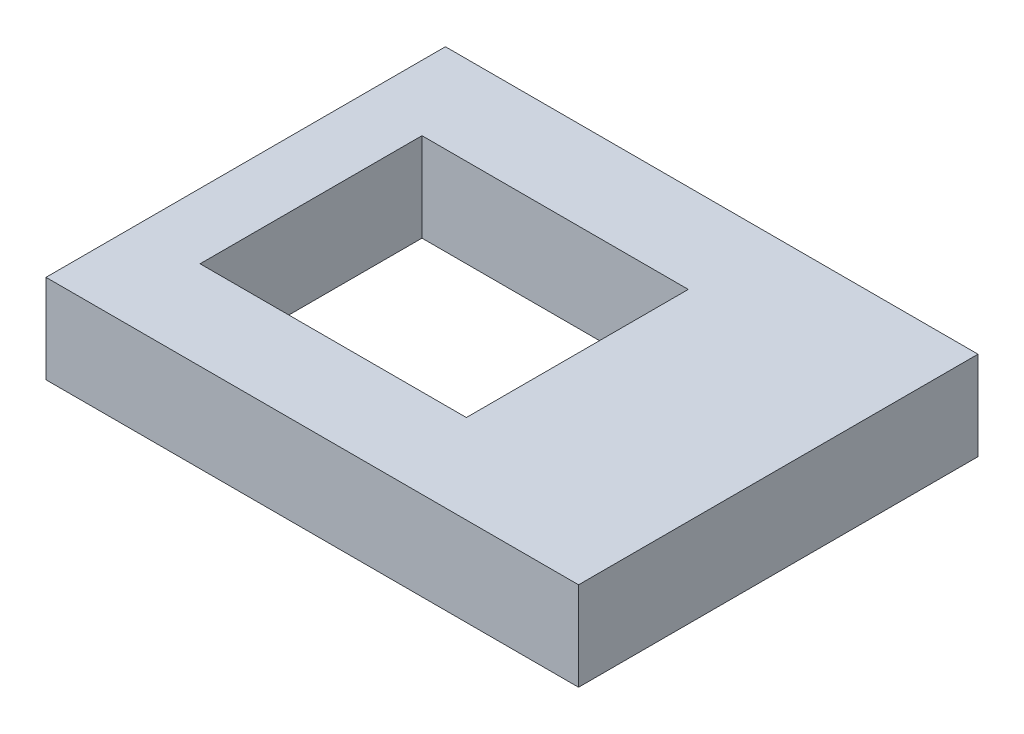
ISO-10303-21;
HEADER;
FILE_DESCRIPTION(('STEP AP214'),'2;1');
FILE_NAME('part.step','',(''),(''),'','','');
FILE_SCHEMA(('AUTOMOTIVE_DESIGN { 1 0 10303 214 1 1 1 1 }'));
ENDSEC;
DATA;
#1=APPLICATION_CONTEXT('core data for automotive mechanical design processes');
#2=APPLICATION_PROTOCOL_DEFINITION('international standard','automotive_design',2000,#1);
#3=PRODUCT_CONTEXT('',#1,'mechanical');
#4=PRODUCT('Part','Part','',(#3));
#5=PRODUCT_RELATED_PRODUCT_CATEGORY('part','',(#4));
#6=PRODUCT_DEFINITION_FORMATION('','',#4);
#7=PRODUCT_DEFINITION_CONTEXT('part definition',#1,'design');
#8=PRODUCT_DEFINITION('design','',#6,#7);
#9=PRODUCT_DEFINITION_SHAPE('','',#8);
#10=(LENGTH_UNIT() NAMED_UNIT(*) SI_UNIT(.MILLI.,.METRE.));
#11=(NAMED_UNIT(*) PLANE_ANGLE_UNIT() SI_UNIT($,.RADIAN.));
#12=(NAMED_UNIT(*) SI_UNIT($,.STERADIAN.) SOLID_ANGLE_UNIT());
#13=UNCERTAINTY_MEASURE_WITH_UNIT(LENGTH_MEASURE(1.E-05),#10,'distance_accuracy_value','');
#14=(GEOMETRIC_REPRESENTATION_CONTEXT(3) GLOBAL_UNCERTAINTY_ASSIGNED_CONTEXT((#13)) GLOBAL_UNIT_ASSIGNED_CONTEXT((#10,
#11,#12)) REPRESENTATION_CONTEXT('',''));
#15=CARTESIAN_POINT('',(0.,0.,0.));
#16=DIRECTION('',(0.,0.,1.));
#17=DIRECTION('',(1.,0.,0.));
#18=AXIS2_PLACEMENT_3D('',#15,#16,#17);
#19=CARTESIAN_POINT('',(76.2,25.4,57.15));
#20=DIRECTION('',(-1.,0.,0.));
#21=DIRECTION('',(0.,0.,1.));
#22=AXIS2_PLACEMENT_3D('',#19,#20,#21);
#23=PLANE('',#22);
#24=DIRECTION('',(0.,0.,-1.));
#25=VECTOR('',#24,1.);
#26=CARTESIAN_POINT('',(76.2,0.,57.15));
#27=LINE('',#26,#25);
#28=CARTESIAN_POINT('',(76.2,0.,57.15));
#29=VERTEX_POINT('',#28);
#30=CARTESIAN_POINT('',(76.2,0.,-57.15));
#31=VERTEX_POINT('',#30);
#32=EDGE_CURVE('E147',#29,#31,#27,.T.);
#33=ORIENTED_EDGE('',*,*,#32,.T.);
#34=DIRECTION('',(0.,-1.,0.));
#35=VECTOR('',#34,1.);
#36=CARTESIAN_POINT('',(76.2,25.4,-57.15));
#37=LINE('',#36,#35);
#38=CARTESIAN_POINT('',(76.2,25.4,-57.15));
#39=VERTEX_POINT('',#38);
#40=EDGE_CURVE('E11',#39,#31,#37,.T.);
#41=ORIENTED_EDGE('',*,*,#40,.F.);
#42=DIRECTION('',(0.,0.,-1.));
#43=VECTOR('',#42,1.);
#44=CARTESIAN_POINT('',(76.2,25.4,57.15));
#45=LINE('',#44,#43);
#46=CARTESIAN_POINT('',(76.2,25.4,57.15));
#47=VERTEX_POINT('',#46);
#48=EDGE_CURVE('E153',#47,#39,#45,.T.);
#49=ORIENTED_EDGE('',*,*,#48,.F.);
#50=DIRECTION('',(0.,-1.,0.));
#51=VECTOR('',#50,1.);
#52=CARTESIAN_POINT('',(76.2,25.4,57.15));
#53=LINE('',#52,#51);
#54=EDGE_CURVE('E167',#47,#29,#53,.T.);
#55=ORIENTED_EDGE('',*,*,#54,.T.);
#56=EDGE_LOOP('',(#33,#41,#49,#55));
#57=FACE_BOUND('',#56,.T.);
#58=ADVANCED_FACE('F39',(#57),#23,.F.);
#59=CARTESIAN_POINT('',(-76.2,25.4,-57.15));
#60=DIRECTION('',(0.,0.,1.));
#61=DIRECTION('',(1.,0.,0.));
#62=AXIS2_PLACEMENT_3D('',#59,#60,#61);
#63=PLANE('',#62);
#64=DIRECTION('',(-1.,0.,0.));
#65=VECTOR('',#64,1.);
#66=CARTESIAN_POINT('',(-76.2,0.,-57.15));
#67=LINE('',#66,#65);
#68=CARTESIAN_POINT('',(-76.2,0.,-57.15));
#69=VERTEX_POINT('',#68);
#70=EDGE_CURVE('E171',#31,#69,#67,.T.);
#71=ORIENTED_EDGE('',*,*,#70,.T.);
#72=DIRECTION('',(0.,-1.,0.));
#73=VECTOR('',#72,1.);
#74=CARTESIAN_POINT('',(-76.2,25.4,-57.15));
#75=LINE('',#74,#73);
#76=CARTESIAN_POINT('',(-76.2,25.4,-57.15));
#77=VERTEX_POINT('',#76);
#78=EDGE_CURVE('E47',#77,#69,#75,.T.);
#79=ORIENTED_EDGE('',*,*,#78,.F.);
#80=DIRECTION('',(-1.,0.,0.));
#81=VECTOR('',#80,1.);
#82=CARTESIAN_POINT('',(-76.2,25.4,-57.15));
#83=LINE('',#82,#81);
#84=EDGE_CURVE('E157',#39,#77,#83,.T.);
#85=ORIENTED_EDGE('',*,*,#84,.F.);
#86=ORIENTED_EDGE('',*,*,#40,.T.);
#87=EDGE_LOOP('',(#71,#79,#85,#86));
#88=FACE_BOUND('',#87,.T.);
#89=ADVANCED_FACE('F205',(#88),#63,.F.);
#90=CARTESIAN_POINT('',(-76.2,25.4,57.15));
#91=DIRECTION('',(1.,0.,0.));
#92=DIRECTION('',(0.,0.,-1.));
#93=AXIS2_PLACEMENT_3D('',#90,#91,#92);
#94=PLANE('',#93);
#95=DIRECTION('',(0.,0.,1.));
#96=VECTOR('',#95,1.);
#97=CARTESIAN_POINT('',(-76.2,0.,57.15));
#98=LINE('',#97,#96);
#99=CARTESIAN_POINT('',(-76.2,0.,57.15));
#100=VERTEX_POINT('',#99);
#101=EDGE_CURVE('E174',#69,#100,#98,.T.);
#102=ORIENTED_EDGE('',*,*,#101,.T.);
#103=DIRECTION('',(0.,-1.,0.));
#104=VECTOR('',#103,1.);
#105=CARTESIAN_POINT('',(-76.2,25.4,57.15));
#106=LINE('',#105,#104);
#107=CARTESIAN_POINT('',(-76.2,25.4,57.15));
#108=VERTEX_POINT('',#107);
#109=EDGE_CURVE('E182',#108,#100,#106,.T.);
#110=ORIENTED_EDGE('',*,*,#109,.F.);
#111=DIRECTION('',(0.,0.,1.));
#112=VECTOR('',#111,1.);
#113=CARTESIAN_POINT('',(-76.2,25.4,57.15));
#114=LINE('',#113,#112);
#115=EDGE_CURVE('E161',#77,#108,#114,.T.);
#116=ORIENTED_EDGE('',*,*,#115,.F.);
#117=ORIENTED_EDGE('',*,*,#78,.T.);
#118=EDGE_LOOP('',(#102,#110,#116,#117));
#119=FACE_BOUND('',#118,.T.);
#120=ADVANCED_FACE('F191',(#119),#94,.F.);
#121=CARTESIAN_POINT('',(-76.2,25.4,57.15));
#122=DIRECTION('',(0.,0.,-1.));
#123=DIRECTION('',(-1.,0.,0.));
#124=AXIS2_PLACEMENT_3D('',#121,#122,#123);
#125=PLANE('',#124);
#126=DIRECTION('',(1.,0.,0.));
#127=VECTOR('',#126,1.);
#128=CARTESIAN_POINT('',(-76.2,0.,57.15));
#129=LINE('',#128,#127);
#130=EDGE_CURVE('E158',#100,#29,#129,.T.);
#131=ORIENTED_EDGE('',*,*,#130,.T.);
#132=ORIENTED_EDGE('',*,*,#54,.F.);
#133=DIRECTION('',(1.,0.,0.));
#134=VECTOR('',#133,1.);
#135=CARTESIAN_POINT('',(-76.2,25.4,57.15));
#136=LINE('',#135,#134);
#137=EDGE_CURVE('E164',#108,#47,#136,.T.);
#138=ORIENTED_EDGE('',*,*,#137,.F.);
#139=ORIENTED_EDGE('',*,*,#109,.T.);
#140=EDGE_LOOP('',(#131,#132,#138,#139));
#141=FACE_BOUND('',#140,.T.);
#142=ADVANCED_FACE('F198',(#141),#125,.F.);
#143=CARTESIAN_POINT('',(0.,25.4,0.));
#144=DIRECTION('',(0.,-1.,0.));
#145=DIRECTION('',(0.,0.,-1.));
#146=AXIS2_PLACEMENT_3D('',#143,#144,#145);
#147=PLANE('',#146);
#148=DIRECTION('',(-1.,0.,0.));
#149=VECTOR('',#148,1.);
#150=CARTESIAN_POINT('',(-57.5070941527196,25.4,-31.75));
#151=LINE('',#150,#149);
#152=CARTESIAN_POINT('',(18.6929058472804,25.4,-31.75));
#153=VERTEX_POINT('',#152);
#154=CARTESIAN_POINT('',(-57.5070941527196,25.4,-31.75));
#155=VERTEX_POINT('',#154);
#156=EDGE_CURVE('E138',#153,#155,#151,.T.);
#157=ORIENTED_EDGE('',*,*,#156,.F.);
#158=DIRECTION('',(0.,0.,-1.));
#159=VECTOR('',#158,1.);
#160=CARTESIAN_POINT('',(18.6929058472804,25.4,31.75));
#161=LINE('',#160,#159);
#162=CARTESIAN_POINT('',(18.6929058472804,25.4,31.75));
#163=VERTEX_POINT('',#162);
#164=EDGE_CURVE('E54',#163,#153,#161,.T.);
#165=ORIENTED_EDGE('',*,*,#164,.F.);
#166=DIRECTION('',(1.,0.,0.));
#167=VECTOR('',#166,1.);
#168=CARTESIAN_POINT('',(-57.5070941527196,25.4,31.75));
#169=LINE('',#168,#167);
#170=CARTESIAN_POINT('',(-57.5070941527196,25.4,31.75));
#171=VERTEX_POINT('',#170);
#172=EDGE_CURVE('E125',#171,#163,#169,.T.);
#173=ORIENTED_EDGE('',*,*,#172,.F.);
#174=DIRECTION('',(0.,0.,1.));
#175=VECTOR('',#174,1.);
#176=CARTESIAN_POINT('',(-57.5070941527196,25.4,31.75));
#177=LINE('',#176,#175);
#178=EDGE_CURVE('E129',#155,#171,#177,.T.);
#179=ORIENTED_EDGE('',*,*,#178,.F.);
#180=EDGE_LOOP('',(#157,#165,#173,#179));
#181=FACE_BOUND('',#180,.T.);
#182=ORIENTED_EDGE('',*,*,#48,.T.);
#183=ORIENTED_EDGE('',*,*,#84,.T.);
#184=ORIENTED_EDGE('',*,*,#115,.T.);
#185=ORIENTED_EDGE('',*,*,#137,.T.);
#186=EDGE_LOOP('',(#182,#183,#184,#185));
#187=FACE_BOUND('',#186,.T.);
#188=ADVANCED_FACE('F204',(#181,#187),#147,.F.);
#189=CARTESIAN_POINT('',(0.,0.,0.));
#190=DIRECTION('',(0.,-1.,0.));
#191=DIRECTION('',(0.,0.,-1.));
#192=AXIS2_PLACEMENT_3D('',#189,#190,#191);
#193=PLANE('',#192);
#194=DIRECTION('',(0.,0.,-1.));
#195=VECTOR('',#194,1.);
#196=CARTESIAN_POINT('',(18.6929058472804,0.,31.75));
#197=LINE('',#196,#195);
#198=CARTESIAN_POINT('',(18.6929058472804,0.,31.75));
#199=VERTEX_POINT('',#198);
#200=CARTESIAN_POINT('',(18.6929058472804,0.,-31.75));
#201=VERTEX_POINT('',#200);
#202=EDGE_CURVE('E106',#199,#201,#197,.T.);
#203=ORIENTED_EDGE('',*,*,#202,.T.);
#204=DIRECTION('',(-1.,0.,0.));
#205=VECTOR('',#204,1.);
#206=CARTESIAN_POINT('',(-57.5070941527196,0.,-31.75));
#207=LINE('',#206,#205);
#208=CARTESIAN_POINT('',(-57.5070941527196,0.,-31.75));
#209=VERTEX_POINT('',#208);
#210=EDGE_CURVE('E116',#201,#209,#207,.T.);
#211=ORIENTED_EDGE('',*,*,#210,.T.);
#212=DIRECTION('',(0.,0.,1.));
#213=VECTOR('',#212,1.);
#214=CARTESIAN_POINT('',(-57.5070941527196,0.,31.75));
#215=LINE('',#214,#213);
#216=CARTESIAN_POINT('',(-57.5070941527196,0.,31.75));
#217=VERTEX_POINT('',#216);
#218=EDGE_CURVE('E62',#209,#217,#215,.T.);
#219=ORIENTED_EDGE('',*,*,#218,.T.);
#220=DIRECTION('',(1.,0.,0.));
#221=VECTOR('',#220,1.);
#222=CARTESIAN_POINT('',(-57.5070941527196,0.,31.75));
#223=LINE('',#222,#221);
#224=EDGE_CURVE('E113',#217,#199,#223,.T.);
#225=ORIENTED_EDGE('',*,*,#224,.T.);
#226=EDGE_LOOP('',(#203,#211,#219,#225));
#227=FACE_BOUND('',#226,.T.);
#228=ORIENTED_EDGE('',*,*,#32,.F.);
#229=ORIENTED_EDGE('',*,*,#130,.F.);
#230=ORIENTED_EDGE('',*,*,#101,.F.);
#231=ORIENTED_EDGE('',*,*,#70,.F.);
#232=EDGE_LOOP('',(#228,#229,#230,#231));
#233=FACE_BOUND('',#232,.T.);
#234=ADVANCED_FACE('F121',(#227,#233),#193,.T.);
#235=CARTESIAN_POINT('',(18.6929058472804,0.,31.75));
#236=DIRECTION('',(1.,0.,0.));
#237=DIRECTION('',(0.,0.,-1.));
#238=AXIS2_PLACEMENT_3D('',#235,#236,#237);
#239=PLANE('',#238);
#240=ORIENTED_EDGE('',*,*,#164,.T.);
#241=DIRECTION('',(0.,1.,0.));
#242=VECTOR('',#241,1.);
#243=CARTESIAN_POINT('',(18.6929058472804,0.,-31.75));
#244=LINE('',#243,#242);
#245=EDGE_CURVE('E102',#201,#153,#244,.T.);
#246=ORIENTED_EDGE('',*,*,#245,.F.);
#247=ORIENTED_EDGE('',*,*,#202,.F.);
#248=DIRECTION('',(0.,1.,0.));
#249=VECTOR('',#248,1.);
#250=CARTESIAN_POINT('',(18.6929058472804,0.,31.75));
#251=LINE('',#250,#249);
#252=EDGE_CURVE('E144',#199,#163,#251,.T.);
#253=ORIENTED_EDGE('',*,*,#252,.T.);
#254=EDGE_LOOP('',(#240,#246,#247,#253));
#255=FACE_BOUND('',#254,.T.);
#256=ADVANCED_FACE('F104',(#255),#239,.F.);
#257=CARTESIAN_POINT('',(-57.5070941527196,0.,31.75));
#258=DIRECTION('',(0.,0.,1.));
#259=DIRECTION('',(1.,0.,0.));
#260=AXIS2_PLACEMENT_3D('',#257,#258,#259);
#261=PLANE('',#260);
#262=ORIENTED_EDGE('',*,*,#172,.T.);
#263=ORIENTED_EDGE('',*,*,#252,.F.);
#264=ORIENTED_EDGE('',*,*,#224,.F.);
#265=DIRECTION('',(0.,1.,0.));
#266=VECTOR('',#265,1.);
#267=CARTESIAN_POINT('',(-57.5070941527196,0.,31.75));
#268=LINE('',#267,#266);
#269=EDGE_CURVE('E148',#217,#171,#268,.T.);
#270=ORIENTED_EDGE('',*,*,#269,.T.);
#271=EDGE_LOOP('',(#262,#263,#264,#270));
#272=FACE_BOUND('',#271,.T.);
#273=ADVANCED_FACE('F222',(#272),#261,.F.);
#274=CARTESIAN_POINT('',(-57.5070941527196,0.,31.75));
#275=DIRECTION('',(-1.,0.,0.));
#276=DIRECTION('',(0.,0.,1.));
#277=AXIS2_PLACEMENT_3D('',#274,#275,#276);
#278=PLANE('',#277);
#279=ORIENTED_EDGE('',*,*,#178,.T.);
#280=ORIENTED_EDGE('',*,*,#269,.F.);
#281=ORIENTED_EDGE('',*,*,#218,.F.);
#282=DIRECTION('',(0.,1.,0.));
#283=VECTOR('',#282,1.);
#284=CARTESIAN_POINT('',(-57.5070941527196,0.,-31.75));
#285=LINE('',#284,#283);
#286=EDGE_CURVE('E112',#209,#155,#285,.T.);
#287=ORIENTED_EDGE('',*,*,#286,.T.);
#288=EDGE_LOOP('',(#279,#280,#281,#287));
#289=FACE_BOUND('',#288,.T.);
#290=ADVANCED_FACE('F225',(#289),#278,.F.);
#291=CARTESIAN_POINT('',(-57.5070941527196,0.,-31.75));
#292=DIRECTION('',(0.,0.,-1.));
#293=DIRECTION('',(-1.,0.,0.));
#294=AXIS2_PLACEMENT_3D('',#291,#292,#293);
#295=PLANE('',#294);
#296=ORIENTED_EDGE('',*,*,#156,.T.);
#297=ORIENTED_EDGE('',*,*,#286,.F.);
#298=ORIENTED_EDGE('',*,*,#210,.F.);
#299=ORIENTED_EDGE('',*,*,#245,.T.);
#300=EDGE_LOOP('',(#296,#297,#298,#299));
#301=FACE_BOUND('',#300,.T.);
#302=ADVANCED_FACE('F117',(#301),#295,.F.);
#303=CLOSED_SHELL('',(#58,#89,#120,#142,#188,#234,#256,#273,#290,#302));
#304=MANIFOLD_SOLID_BREP('B2',#303);
#305=ADVANCED_BREP_SHAPE_REPRESENTATION('',(#18,#304),#14);
#306=SHAPE_DEFINITION_REPRESENTATION(#9,#305);
ENDSEC;
END-ISO-10303-21;
